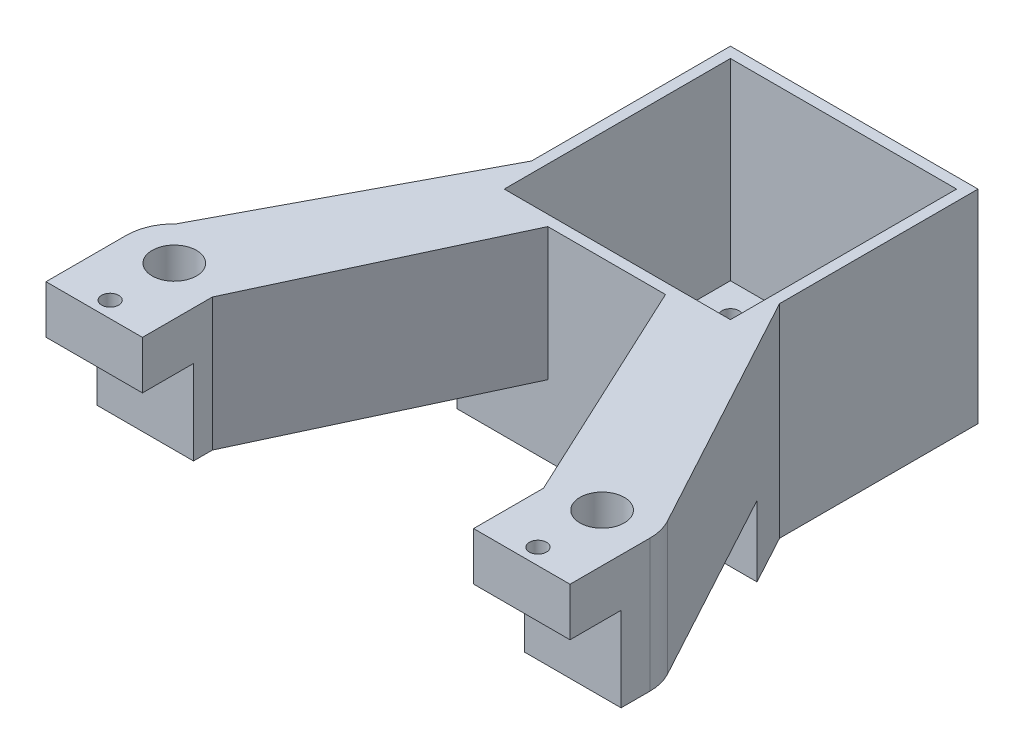
ISO-10303-21;
HEADER;
FILE_DESCRIPTION(('STEP AP214'),'2;1');
FILE_NAME('part.step','',(''),(''),'','','');
FILE_SCHEMA(('AUTOMOTIVE_DESIGN { 1 0 10303 214 1 1 1 1 }'));
ENDSEC;
DATA;
#1=APPLICATION_CONTEXT('core data for automotive mechanical design processes');
#2=APPLICATION_PROTOCOL_DEFINITION('international standard','automotive_design',2000,#1);
#3=PRODUCT_CONTEXT('',#1,'mechanical');
#4=PRODUCT('Part','Part','',(#3));
#5=PRODUCT_RELATED_PRODUCT_CATEGORY('part','',(#4));
#6=PRODUCT_DEFINITION_FORMATION('','',#4);
#7=PRODUCT_DEFINITION_CONTEXT('part definition',#1,'design');
#8=PRODUCT_DEFINITION('design','',#6,#7);
#9=PRODUCT_DEFINITION_SHAPE('','',#8);
#10=(LENGTH_UNIT() NAMED_UNIT(*) SI_UNIT(.MILLI.,.METRE.));
#11=(NAMED_UNIT(*) PLANE_ANGLE_UNIT() SI_UNIT($,.RADIAN.));
#12=(NAMED_UNIT(*) SI_UNIT($,.STERADIAN.) SOLID_ANGLE_UNIT());
#13=UNCERTAINTY_MEASURE_WITH_UNIT(LENGTH_MEASURE(1.E-05),#10,'distance_accuracy_value','');
#14=(GEOMETRIC_REPRESENTATION_CONTEXT(3) GLOBAL_UNCERTAINTY_ASSIGNED_CONTEXT((#13)) GLOBAL_UNIT_ASSIGNED_CONTEXT((#10,
#11,#12)) REPRESENTATION_CONTEXT('',''));
#15=CARTESIAN_POINT('',(0.,0.,0.));
#16=DIRECTION('',(0.,0.,1.));
#17=DIRECTION('',(1.,0.,0.));
#18=AXIS2_PLACEMENT_3D('',#15,#16,#17);
#19=CARTESIAN_POINT('',(0.,-19.8,0.));
#20=DIRECTION('',(0.,-1.,0.));
#21=DIRECTION('',(0.,0.,-1.));
#22=AXIS2_PLACEMENT_3D('',#19,#20,#21);
#23=PLANE('',#22);
#24=CARTESIAN_POINT('',(40.,-19.8,64.));
#25=DIRECTION('',(0.,-1.,0.));
#26=DIRECTION('',(0.,0.,-1.));
#27=AXIS2_PLACEMENT_3D('',#24,#25,#26);
#28=CIRCLE('',#27,4.15);
#29=CARTESIAN_POINT('',(40.,-19.8,59.85));
#30=VERTEX_POINT('',#29);
#31=EDGE_CURVE('E225',#30,#30,#28,.F.);
#32=ORIENTED_EDGE('',*,*,#31,.T.);
#33=EDGE_LOOP('',(#32));
#34=FACE_BOUND('',#33,.T.);
#35=DIRECTION('',(-1.,0.,0.));
#36=VECTOR('',#35,1.);
#37=CARTESIAN_POINT('',(0.,-19.8,23.15));
#38=LINE('',#37,#36);
#39=CARTESIAN_POINT('',(28.1190833832393,-19.8,23.15));
#40=VERTEX_POINT('',#39);
#41=CARTESIAN_POINT('',(11.0034052717595,-19.8,23.15));
#42=VERTEX_POINT('',#41);
#43=EDGE_CURVE('E48',#40,#42,#38,.T.);
#44=ORIENTED_EDGE('',*,*,#43,.F.);
#45=DIRECTION('',(0.476084939245589,0.,0.87939930101378));
#46=VECTOR('',#45,1.);
#47=CARTESIAN_POINT('',(12.0535181151364,-19.8,-6.52547532494617));
#48=LINE('',#47,#46);
#49=CARTESIAN_POINT('',(47.914593709124,-19.8,59.7152355467897));
#50=VERTEX_POINT('',#49);
#51=EDGE_CURVE('E372',#40,#50,#48,.T.);
#52=ORIENTED_EDGE('',*,*,#51,.T.);
#53=CARTESIAN_POINT('',(40.,-19.8,64.));
#54=DIRECTION('',(0.,-1.,0.));
#55=DIRECTION('',(0.,0.,-1.));
#56=AXIS2_PLACEMENT_3D('',#53,#54,#55);
#57=CIRCLE('',#56,8.99999999999998);
#58=CARTESIAN_POINT('',(49.,-19.8,64.));
#59=VERTEX_POINT('',#58);
#60=EDGE_CURVE('E369',#59,#50,#57,.F.);
#61=ORIENTED_EDGE('',*,*,#60,.F.);
#62=DIRECTION('',(0.,0.,1.));
#63=VECTOR('',#62,1.);
#64=CARTESIAN_POINT('',(49.,-19.8,0.));
#65=LINE('',#64,#63);
#66=CARTESIAN_POINT('',(49.,-19.8,69.4505109846348));
#67=VERTEX_POINT('',#66);
#68=EDGE_CURVE('E366',#59,#67,#65,.T.);
#69=ORIENTED_EDGE('',*,*,#68,.T.);
#70=DIRECTION('',(1.,0.,0.));
#71=VECTOR('',#70,1.);
#72=CARTESIAN_POINT('',(0.,-19.8,69.4505109846348));
#73=LINE('',#72,#71);
#74=CARTESIAN_POINT('',(30.9638982325282,-19.8,69.4505109846348));
#75=VERTEX_POINT('',#74);
#76=EDGE_CURVE('E464',#75,#67,#73,.T.);
#77=ORIENTED_EDGE('',*,*,#76,.F.);
#78=DIRECTION('',(0.,0.,-1.));
#79=VECTOR('',#78,1.);
#80=CARTESIAN_POINT('',(30.9638982325284,-19.8,0.));
#81=LINE('',#80,#79);
#82=CARTESIAN_POINT('',(30.9638982325282,-19.8,65.9194183730972));
#83=VERTEX_POINT('',#82);
#84=EDGE_CURVE('E364',#75,#83,#81,.T.);
#85=ORIENTED_EDGE('',*,*,#84,.T.);
#86=DIRECTION('',(0.42291036319294,0.,0.906171520576549));
#87=VECTOR('',#86,1.);
#88=CARTESIAN_POINT('',(0.163652382515475,-19.8,-0.0763765876055947));
#89=LINE('',#88,#87);
#90=EDGE_CURVE('E361',#42,#83,#89,.T.);
#91=ORIENTED_EDGE('',*,*,#90,.F.);
#92=EDGE_LOOP('',(#44,#52,#61,#69,#77,#85,#91));
#93=FACE_BOUND('',#92,.T.);
#94=ADVANCED_FACE('F37',(#34,#93),#23,.T.);
#95=CARTESIAN_POINT('',(23.15,-33.,-21.15));
#96=DIRECTION('',(1.,0.,0.));
#97=DIRECTION('',(0.,0.,-1.));
#98=AXIS2_PLACEMENT_3D('',#95,#96,#97);
#99=PLANE('',#98);
#100=DIRECTION('',(0.,1.,0.));
#101=VECTOR('',#100,1.);
#102=CARTESIAN_POINT('',(23.15,-33.,13.9713680087752));
#103=LINE('',#102,#101);
#104=CARTESIAN_POINT('',(23.15,-33.,13.9713680087752));
#105=VERTEX_POINT('',#104);
#106=CARTESIAN_POINT('',(23.15,5.,13.9713680087752));
#107=VERTEX_POINT('',#106);
#108=EDGE_CURVE('E391',#105,#107,#103,.T.);
#109=ORIENTED_EDGE('',*,*,#108,.F.);
#110=DIRECTION('',(0.,0.,1.));
#111=VECTOR('',#110,1.);
#112=CARTESIAN_POINT('',(23.15,-33.,-21.15));
#113=LINE('',#112,#111);
#114=CARTESIAN_POINT('',(23.15,-33.,-23.15));
#115=VERTEX_POINT('',#114);
#116=EDGE_CURVE('E300',#115,#105,#113,.T.);
#117=ORIENTED_EDGE('',*,*,#116,.F.);
#118=DIRECTION('',(0.,-1.,0.));
#119=VECTOR('',#118,1.);
#120=CARTESIAN_POINT('',(23.15,-33.,-23.15));
#121=LINE('',#120,#119);
#122=CARTESIAN_POINT('',(23.15,5.,-23.15));
#123=VERTEX_POINT('',#122);
#124=EDGE_CURVE('E236',#123,#115,#121,.T.);
#125=ORIENTED_EDGE('',*,*,#124,.F.);
#126=DIRECTION('',(0.,0.,-1.));
#127=VECTOR('',#126,1.);
#128=CARTESIAN_POINT('',(23.15,5.,-21.15));
#129=LINE('',#128,#127);
#130=EDGE_CURVE('E232',#107,#123,#129,.T.);
#131=ORIENTED_EDGE('',*,*,#130,.F.);
#132=EDGE_LOOP('',(#109,#117,#125,#131));
#133=FACE_BOUND('',#132,.T.);
#134=ADVANCED_FACE('F538',(#133),#99,.T.);
#135=CARTESIAN_POINT('',(-23.15,-33.,21.15));
#136=DIRECTION('',(-1.,0.,0.));
#137=DIRECTION('',(0.,0.,1.));
#138=AXIS2_PLACEMENT_3D('',#135,#136,#137);
#139=PLANE('',#138);
#140=DIRECTION('',(0.,0.,1.));
#141=VECTOR('',#140,1.);
#142=CARTESIAN_POINT('',(-23.15,5.,21.15));
#143=LINE('',#142,#141);
#144=CARTESIAN_POINT('',(-23.15,5.,-23.15));
#145=VERTEX_POINT('',#144);
#146=CARTESIAN_POINT('',(-23.15,5.,14.0503679174957));
#147=VERTEX_POINT('',#146);
#148=EDGE_CURVE('E214',#145,#147,#143,.T.);
#149=ORIENTED_EDGE('',*,*,#148,.F.);
#150=DIRECTION('',(0.,1.,0.));
#151=VECTOR('',#150,1.);
#152=CARTESIAN_POINT('',(-23.15,5.,-23.15));
#153=LINE('',#152,#151);
#154=CARTESIAN_POINT('',(-23.15,-33.,-23.15));
#155=VERTEX_POINT('',#154);
#156=EDGE_CURVE('E219',#155,#145,#153,.T.);
#157=ORIENTED_EDGE('',*,*,#156,.F.);
#158=DIRECTION('',(0.,0.,-1.));
#159=VECTOR('',#158,1.);
#160=CARTESIAN_POINT('',(-23.15,-33.,14.0503679174957));
#161=LINE('',#160,#159);
#162=CARTESIAN_POINT('',(-23.15,-33.,14.0503679174957));
#163=VERTEX_POINT('',#162);
#164=EDGE_CURVE('E298',#163,#155,#161,.T.);
#165=ORIENTED_EDGE('',*,*,#164,.F.);
#166=DIRECTION('',(0.,1.,0.));
#167=VECTOR('',#166,1.);
#168=CARTESIAN_POINT('',(-23.15,-33.,14.0503679174957));
#169=LINE('',#168,#167);
#170=EDGE_CURVE('E220',#163,#147,#169,.T.);
#171=ORIENTED_EDGE('',*,*,#170,.T.);
#172=EDGE_LOOP('',(#149,#157,#165,#171));
#173=FACE_BOUND('',#172,.T.);
#174=ADVANCED_FACE('F216',(#173),#139,.T.);
#175=CARTESIAN_POINT('',(-40.,-19.8,64.));
#176=DIRECTION('',(0.,-1.,0.));
#177=DIRECTION('',(0.,0.,-1.));
#178=AXIS2_PLACEMENT_3D('',#175,#176,#177);
#179=CIRCLE('',#178,4.15);
#180=CARTESIAN_POINT('',(-40.,-19.8,59.85));
#181=VERTEX_POINT('',#180);
#182=EDGE_CURVE('E374',#181,#181,#179,.F.);
#183=ORIENTED_EDGE('',*,*,#182,.T.);
#184=EDGE_LOOP('',(#183));
#185=FACE_BOUND('',#184,.T.);
#186=DIRECTION('',(-0.468856217453364,0.,0.88327450283325));
#187=VECTOR('',#186,1.);
#188=CARTESIAN_POINT('',(-12.2423633707478,-19.8,-6.4984420633526));
#189=LINE('',#188,#187);
#190=CARTESIAN_POINT('',(-27.9802300867228,-19.8,23.15));
#191=VERTEX_POINT('',#190);
#192=CARTESIAN_POINT('',(-46.2022692479095,-19.8,57.4783547952656));
#193=VERTEX_POINT('',#192);
#194=EDGE_CURVE('E348',#191,#193,#189,.T.);
#195=ORIENTED_EDGE('',*,*,#194,.F.);
#196=CARTESIAN_POINT('',(-11.0034052717595,-19.8,23.15));
#197=VERTEX_POINT('',#196);
#198=EDGE_CURVE('E11',#197,#191,#38,.T.);
#199=ORIENTED_EDGE('',*,*,#198,.F.);
#200=DIRECTION('',(-0.422910363192941,0.,0.906171520576549));
#201=VECTOR('',#200,1.);
#202=CARTESIAN_POINT('',(-0.163652382515457,-19.8,-0.076376587605586));
#203=LINE('',#202,#201);
#204=CARTESIAN_POINT('',(-30.9638982325283,-19.8,65.9194183730972));
#205=VERTEX_POINT('',#204);
#206=EDGE_CURVE('E359',#197,#205,#203,.T.);
#207=ORIENTED_EDGE('',*,*,#206,.T.);
#208=DIRECTION('',(0.,0.,1.));
#209=VECTOR('',#208,1.);
#210=CARTESIAN_POINT('',(-30.9638982325283,-19.8,0.));
#211=LINE('',#210,#209);
#212=CARTESIAN_POINT('',(-30.9638982325283,-19.8,69.4505109846348));
#213=VERTEX_POINT('',#212);
#214=EDGE_CURVE('E356',#205,#213,#211,.T.);
#215=ORIENTED_EDGE('',*,*,#214,.T.);
#216=CARTESIAN_POINT('',(-49.,-19.8,69.4505109846348));
#217=VERTEX_POINT('',#216);
#218=EDGE_CURVE('E46',#217,#213,#73,.T.);
#219=ORIENTED_EDGE('',*,*,#218,.F.);
#220=DIRECTION('',(0.,0.,1.));
#221=VECTOR('',#220,1.);
#222=CARTESIAN_POINT('',(-49.,-19.8,0.));
#223=LINE('',#222,#221);
#224=CARTESIAN_POINT('',(-49.,-19.8,64.));
#225=VERTEX_POINT('',#224);
#226=EDGE_CURVE('E353',#225,#217,#223,.T.);
#227=ORIENTED_EDGE('',*,*,#226,.F.);
#228=CARTESIAN_POINT('',(-40.,-19.8,64.));
#229=DIRECTION('',(0.,-1.,0.));
#230=DIRECTION('',(0.,0.,-1.));
#231=AXIS2_PLACEMENT_3D('',#228,#229,#230);
#232=CIRCLE('',#231,9.);
#233=EDGE_CURVE('E350',#193,#225,#232,.F.);
#234=ORIENTED_EDGE('',*,*,#233,.F.);
#235=EDGE_LOOP('',(#195,#199,#207,#215,#219,#227,#234));
#236=FACE_BOUND('',#235,.T.);
#237=ADVANCED_FACE('F475',(#185,#236),#23,.T.);
#238=CARTESIAN_POINT('',(0.,-33.,21.15));
#239=DIRECTION('',(0.,0.,1.));
#240=DIRECTION('',(1.,0.,0.));
#241=AXIS2_PLACEMENT_3D('',#238,#239,#240);
#242=PLANE('',#241);
#243=DIRECTION('',(0.,1.,0.));
#244=VECTOR('',#243,1.);
#245=CARTESIAN_POINT('',(21.15,-33.,21.15));
#246=LINE('',#245,#244);
#247=CARTESIAN_POINT('',(21.15,-31.,21.15));
#248=VERTEX_POINT('',#247);
#249=CARTESIAN_POINT('',(21.15,5.,21.15));
#250=VERTEX_POINT('',#249);
#251=EDGE_CURVE('E459',#248,#250,#246,.T.);
#252=ORIENTED_EDGE('',*,*,#251,.F.);
#253=DIRECTION('',(1.,0.,0.));
#254=VECTOR('',#253,1.);
#255=CARTESIAN_POINT('',(0.,-31.,21.15));
#256=LINE('',#255,#254);
#257=CARTESIAN_POINT('',(-21.15,-31.,21.15));
#258=VERTEX_POINT('',#257);
#259=EDGE_CURVE('E314',#258,#248,#256,.T.);
#260=ORIENTED_EDGE('',*,*,#259,.F.);
#261=DIRECTION('',(0.,1.,0.));
#262=VECTOR('',#261,1.);
#263=CARTESIAN_POINT('',(-21.15,-33.,21.15));
#264=LINE('',#263,#262);
#265=CARTESIAN_POINT('',(-21.15,5.,21.15));
#266=VERTEX_POINT('',#265);
#267=EDGE_CURVE('E417',#258,#266,#264,.T.);
#268=ORIENTED_EDGE('',*,*,#267,.T.);
#269=DIRECTION('',(-1.,0.,0.));
#270=VECTOR('',#269,1.);
#271=CARTESIAN_POINT('',(-21.15,5.,21.15));
#272=LINE('',#271,#270);
#273=EDGE_CURVE('E255',#250,#266,#272,.T.);
#274=ORIENTED_EDGE('',*,*,#273,.F.);
#275=EDGE_LOOP('',(#252,#260,#268,#274));
#276=FACE_BOUND('',#275,.T.);
#277=ADVANCED_FACE('F581',(#276),#242,.F.);
#278=CARTESIAN_POINT('',(21.15,-33.,0.));
#279=DIRECTION('',(1.,0.,0.));
#280=DIRECTION('',(0.,0.,-1.));
#281=AXIS2_PLACEMENT_3D('',#278,#279,#280);
#282=PLANE('',#281);
#283=DIRECTION('',(0.,1.,0.));
#284=VECTOR('',#283,1.);
#285=CARTESIAN_POINT('',(21.15,-33.,-21.15));
#286=LINE('',#285,#284);
#287=CARTESIAN_POINT('',(21.15,-31.,-21.15));
#288=VERTEX_POINT('',#287);
#289=CARTESIAN_POINT('',(21.15,5.,-21.15));
#290=VERTEX_POINT('',#289);
#291=EDGE_CURVE('E388',#288,#290,#286,.T.);
#292=ORIENTED_EDGE('',*,*,#291,.F.);
#293=DIRECTION('',(0.,0.,-1.));
#294=VECTOR('',#293,1.);
#295=CARTESIAN_POINT('',(21.15,-31.,0.));
#296=LINE('',#295,#294);
#297=EDGE_CURVE('E317',#248,#288,#296,.T.);
#298=ORIENTED_EDGE('',*,*,#297,.F.);
#299=ORIENTED_EDGE('',*,*,#251,.T.);
#300=DIRECTION('',(0.,0.,1.));
#301=VECTOR('',#300,1.);
#302=CARTESIAN_POINT('',(21.15,5.,21.15));
#303=LINE('',#302,#301);
#304=EDGE_CURVE('E252',#290,#250,#303,.T.);
#305=ORIENTED_EDGE('',*,*,#304,.F.);
#306=EDGE_LOOP('',(#292,#298,#299,#305));
#307=FACE_BOUND('',#306,.T.);
#308=ADVANCED_FACE('F584',(#307),#282,.F.);
#309=CARTESIAN_POINT('',(49.,-33.,0.));
#310=DIRECTION('',(-1.,0.,0.));
#311=DIRECTION('',(0.,0.,1.));
#312=AXIS2_PLACEMENT_3D('',#309,#310,#311);
#313=PLANE('',#312);
#314=DIRECTION('',(0.,1.,0.));
#315=VECTOR('',#314,1.);
#316=CARTESIAN_POINT('',(49.,-33.,79.));
#317=LINE('',#316,#315);
#318=CARTESIAN_POINT('',(49.,-4.,79.));
#319=VERTEX_POINT('',#318);
#320=CARTESIAN_POINT('',(49.,5.,79.));
#321=VERTEX_POINT('',#320);
#322=EDGE_CURVE('E453',#319,#321,#317,.T.);
#323=ORIENTED_EDGE('',*,*,#322,.F.);
#324=DIRECTION('',(0.,0.,1.));
#325=VECTOR('',#324,1.);
#326=CARTESIAN_POINT('',(49.,-4.,79.));
#327=LINE('',#326,#325);
#328=CARTESIAN_POINT('',(49.,-4.,69.4505109846348));
#329=VERTEX_POINT('',#328);
#330=EDGE_CURVE('E323',#329,#319,#327,.T.);
#331=ORIENTED_EDGE('',*,*,#330,.F.);
#332=DIRECTION('',(0.,1.,0.));
#333=VECTOR('',#332,1.);
#334=CARTESIAN_POINT('',(49.,-4.,69.4505109846348));
#335=LINE('',#334,#333);
#336=EDGE_CURVE('E319',#67,#329,#335,.T.);
#337=ORIENTED_EDGE('',*,*,#336,.F.);
#338=ORIENTED_EDGE('',*,*,#68,.F.);
#339=DIRECTION('',(0.,1.,0.));
#340=VECTOR('',#339,1.);
#341=CARTESIAN_POINT('',(49.,-33.,64.));
#342=LINE('',#341,#340);
#343=CARTESIAN_POINT('',(49.,5.,64.));
#344=VERTEX_POINT('',#343);
#345=EDGE_CURVE('E452',#59,#344,#342,.T.);
#346=ORIENTED_EDGE('',*,*,#345,.T.);
#347=DIRECTION('',(0.,0.,1.));
#348=VECTOR('',#347,1.);
#349=CARTESIAN_POINT('',(49.,5.,0.));
#350=LINE('',#349,#348);
#351=EDGE_CURVE('E434',#344,#321,#350,.T.);
#352=ORIENTED_EDGE('',*,*,#351,.T.);
#353=EDGE_LOOP('',(#323,#331,#337,#338,#346,#352));
#354=FACE_BOUND('',#353,.T.);
#355=ADVANCED_FACE('F531',(#354),#313,.F.);
#356=CARTESIAN_POINT('',(0.,-33.,79.));
#357=DIRECTION('',(0.,0.,-1.));
#358=DIRECTION('',(-1.,0.,0.));
#359=AXIS2_PLACEMENT_3D('',#356,#357,#358);
#360=PLANE('',#359);
#361=DIRECTION('',(0.,1.,0.));
#362=VECTOR('',#361,1.);
#363=CARTESIAN_POINT('',(30.9638982325282,-33.,79.));
#364=LINE('',#363,#362);
#365=CARTESIAN_POINT('',(30.9638982325282,-4.,79.));
#366=VERTEX_POINT('',#365);
#367=CARTESIAN_POINT('',(30.9638982325282,5.,79.));
#368=VERTEX_POINT('',#367);
#369=EDGE_CURVE('E455',#366,#368,#364,.T.);
#370=ORIENTED_EDGE('',*,*,#369,.F.);
#371=DIRECTION('',(1.,0.,0.));
#372=VECTOR('',#371,1.);
#373=CARTESIAN_POINT('',(-74.0000000000001,-4.,79.));
#374=LINE('',#373,#372);
#375=EDGE_CURVE('E326',#366,#319,#374,.T.);
#376=ORIENTED_EDGE('',*,*,#375,.T.);
#377=ORIENTED_EDGE('',*,*,#322,.T.);
#378=DIRECTION('',(-1.,0.,0.));
#379=VECTOR('',#378,1.);
#380=CARTESIAN_POINT('',(0.,5.,79.));
#381=LINE('',#380,#379);
#382=EDGE_CURVE('E449',#321,#368,#381,.T.);
#383=ORIENTED_EDGE('',*,*,#382,.T.);
#384=EDGE_LOOP('',(#370,#376,#377,#383));
#385=FACE_BOUND('',#384,.T.);
#386=ADVANCED_FACE('F574',(#385),#360,.F.);
#387=CARTESIAN_POINT('',(30.9638982325284,-33.,0.));
#388=DIRECTION('',(1.,0.,0.));
#389=DIRECTION('',(0.,0.,-1.));
#390=AXIS2_PLACEMENT_3D('',#387,#388,#389);
#391=PLANE('',#390);
#392=DIRECTION('',(0.,1.,0.));
#393=VECTOR('',#392,1.);
#394=CARTESIAN_POINT('',(30.9638982325282,-33.,69.4505109846348));
#395=LINE('',#394,#393);
#396=CARTESIAN_POINT('',(30.9638982325282,-4.,69.4505109846348));
#397=VERTEX_POINT('',#396);
#398=EDGE_CURVE('E63',#75,#397,#395,.T.);
#399=ORIENTED_EDGE('',*,*,#398,.T.);
#400=DIRECTION('',(0.,0.,1.));
#401=VECTOR('',#400,1.);
#402=CARTESIAN_POINT('',(30.9638982325284,-4.,0.));
#403=LINE('',#402,#401);
#404=EDGE_CURVE('E345',#397,#366,#403,.T.);
#405=ORIENTED_EDGE('',*,*,#404,.T.);
#406=ORIENTED_EDGE('',*,*,#369,.T.);
#407=DIRECTION('',(0.,0.,-1.));
#408=VECTOR('',#407,1.);
#409=CARTESIAN_POINT('',(30.9638982325284,5.,0.));
#410=LINE('',#409,#408);
#411=CARTESIAN_POINT('',(30.9638982325282,5.,65.9194183730972));
#412=VERTEX_POINT('',#411);
#413=EDGE_CURVE('E446',#368,#412,#410,.T.);
#414=ORIENTED_EDGE('',*,*,#413,.T.);
#415=DIRECTION('',(0.,1.,0.));
#416=VECTOR('',#415,1.);
#417=CARTESIAN_POINT('',(30.9638982325282,-33.,65.9194183730972));
#418=LINE('',#417,#416);
#419=EDGE_CURVE('E457',#83,#412,#418,.T.);
#420=ORIENTED_EDGE('',*,*,#419,.F.);
#421=ORIENTED_EDGE('',*,*,#84,.F.);
#422=EDGE_LOOP('',(#399,#405,#406,#414,#420,#421));
#423=FACE_BOUND('',#422,.T.);
#424=ADVANCED_FACE('F523',(#423),#391,.F.);
#425=CARTESIAN_POINT('',(0.163652382515475,-33.,-0.0763765876055947));
#426=DIRECTION('',(-0.906171520576549,0.,0.42291036319294));
#427=DIRECTION('',(0.42291036319294,0.,0.906171520576549));
#428=AXIS2_PLACEMENT_3D('',#425,#426,#427);
#429=PLANE('',#428);
#430=DIRECTION('',(0.,1.,0.));
#431=VECTOR('',#430,1.);
#432=CARTESIAN_POINT('',(11.0034052717595,-33.,23.15));
#433=LINE('',#432,#431);
#434=CARTESIAN_POINT('',(11.0034052717595,5.,23.15));
#435=VERTEX_POINT('',#434);
#436=EDGE_CURVE('E385',#42,#435,#433,.T.);
#437=ORIENTED_EDGE('',*,*,#436,.F.);
#438=ORIENTED_EDGE('',*,*,#90,.T.);
#439=ORIENTED_EDGE('',*,*,#419,.T.);
#440=DIRECTION('',(0.42291036319294,0.,0.906171520576549));
#441=VECTOR('',#440,1.);
#442=CARTESIAN_POINT('',(0.163652382515475,5.,-0.0763765876055947));
#443=LINE('',#442,#441);
#444=EDGE_CURVE('E443',#435,#412,#443,.T.);
#445=ORIENTED_EDGE('',*,*,#444,.F.);
#446=EDGE_LOOP('',(#437,#438,#439,#445));
#447=FACE_BOUND('',#446,.T.);
#448=ADVANCED_FACE('F521',(#447),#429,.T.);
#449=CARTESIAN_POINT('',(12.0535181151364,-33.,-6.52547532494617));
#450=DIRECTION('',(-0.87939930101378,0.,0.476084939245588));
#451=DIRECTION('',(0.476084939245589,0.,0.87939930101378));
#452=AXIS2_PLACEMENT_3D('',#449,#450,#451);
#453=PLANE('',#452);
#454=ORIENTED_EDGE('',*,*,#51,.F.);
#455=DIRECTION('',(0.,1.,0.));
#456=VECTOR('',#455,1.);
#457=CARTESIAN_POINT('',(28.1190833832393,-31.,23.15));
#458=LINE('',#457,#456);
#459=CARTESIAN_POINT('',(28.1190833832393,-33.,23.15));
#460=VERTEX_POINT('',#459);
#461=EDGE_CURVE('E303',#460,#40,#458,.T.);
#462=ORIENTED_EDGE('',*,*,#461,.F.);
#463=DIRECTION('',(0.476084939245589,0.,0.87939930101378));
#464=VECTOR('',#463,1.);
#465=CARTESIAN_POINT('',(23.15,-33.,13.9713680087752));
#466=LINE('',#465,#464);
#467=EDGE_CURVE('E289',#105,#460,#466,.T.);
#468=ORIENTED_EDGE('',*,*,#467,.F.);
#469=ORIENTED_EDGE('',*,*,#108,.T.);
#470=DIRECTION('',(0.476084939245589,0.,0.87939930101378));
#471=VECTOR('',#470,1.);
#472=CARTESIAN_POINT('',(12.0535181151364,5.,-6.52547532494617));
#473=LINE('',#472,#471);
#474=CARTESIAN_POINT('',(47.914593709124,5.,59.7152355467897));
#475=VERTEX_POINT('',#474);
#476=EDGE_CURVE('E440',#107,#475,#473,.T.);
#477=ORIENTED_EDGE('',*,*,#476,.T.);
#478=DIRECTION('',(0.,1.,0.));
#479=VECTOR('',#478,1.);
#480=CARTESIAN_POINT('',(47.914593709124,-33.,59.7152355467897));
#481=LINE('',#480,#479);
#482=EDGE_CURVE('E461',#50,#475,#481,.T.);
#483=ORIENTED_EDGE('',*,*,#482,.F.);
#484=EDGE_LOOP('',(#454,#462,#468,#469,#477,#483));
#485=FACE_BOUND('',#484,.T.);
#486=ADVANCED_FACE('F514',(#485),#453,.F.);
#487=CARTESIAN_POINT('',(40.,-33.,64.));
#488=DIRECTION('',(0.,1.,0.));
#489=DIRECTION('',(0.,0.,1.));
#490=AXIS2_PLACEMENT_3D('',#487,#488,#489);
#491=CYLINDRICAL_SURFACE('',#490,4.15);
#492=CARTESIAN_POINT('',(40.,5.,64.));
#493=DIRECTION('',(0.,1.,0.));
#494=DIRECTION('',(0.,0.,1.));
#495=AXIS2_PLACEMENT_3D('',#492,#493,#494);
#496=CIRCLE('',#495,4.15);
#497=CARTESIAN_POINT('',(40.,5.,68.15));
#498=VERTEX_POINT('',#497);
#499=EDGE_CURVE('E431',#498,#498,#496,.T.);
#500=ORIENTED_EDGE('',*,*,#499,.T.);
#501=EDGE_LOOP('',(#500));
#502=FACE_BOUND('',#501,.T.);
#503=ORIENTED_EDGE('',*,*,#31,.F.);
#504=EDGE_LOOP('',(#503));
#505=FACE_BOUND('',#504,.T.);
#506=ADVANCED_FACE('F591',(#502,#505),#491,.F.);
#507=CARTESIAN_POINT('',(40.,-33.,76.));
#508=DIRECTION('',(0.,1.,0.));
#509=DIRECTION('',(0.,0.,1.));
#510=AXIS2_PLACEMENT_3D('',#507,#508,#509);
#511=CYLINDRICAL_SURFACE('',#510,1.6);
#512=CARTESIAN_POINT('',(40.,-4.,76.));
#513=DIRECTION('',(0.,1.,0.));
#514=DIRECTION('',(0.,0.,1.));
#515=AXIS2_PLACEMENT_3D('',#512,#513,#514);
#516=CIRCLE('',#515,1.6);
#517=CARTESIAN_POINT('',(40.,-4.,77.6));
#518=VERTEX_POINT('',#517);
#519=EDGE_CURVE('E342',#518,#518,#516,.F.);
#520=ORIENTED_EDGE('',*,*,#519,.T.);
#521=EDGE_LOOP('',(#520));
#522=FACE_BOUND('',#521,.T.);
#523=CARTESIAN_POINT('',(40.,5.,76.));
#524=DIRECTION('',(0.,1.,0.));
#525=DIRECTION('',(0.,0.,1.));
#526=AXIS2_PLACEMENT_3D('',#523,#524,#525);
#527=CIRCLE('',#526,1.6);
#528=CARTESIAN_POINT('',(40.,5.,77.6));
#529=VERTEX_POINT('',#528);
#530=EDGE_CURVE('E419',#529,#529,#527,.T.);
#531=ORIENTED_EDGE('',*,*,#530,.T.);
#532=EDGE_LOOP('',(#531));
#533=FACE_BOUND('',#532,.T.);
#534=ADVANCED_FACE('F594',(#522,#533),#511,.F.);
#535=CARTESIAN_POINT('',(40.,-33.,64.));
#536=DIRECTION('',(0.,1.,0.));
#537=DIRECTION('',(0.,0.,1.));
#538=AXIS2_PLACEMENT_3D('',#535,#536,#537);
#539=CYLINDRICAL_SURFACE('',#538,8.99999999999998);
#540=ORIENTED_EDGE('',*,*,#345,.F.);
#541=ORIENTED_EDGE('',*,*,#60,.T.);
#542=ORIENTED_EDGE('',*,*,#482,.T.);
#543=CARTESIAN_POINT('',(40.,5.,64.));
#544=DIRECTION('',(0.,1.,0.));
#545=DIRECTION('',(0.,0.,1.));
#546=AXIS2_PLACEMENT_3D('',#543,#544,#545);
#547=CIRCLE('',#546,8.99999999999998);
#548=EDGE_CURVE('E437',#344,#475,#547,.T.);
#549=ORIENTED_EDGE('',*,*,#548,.F.);
#550=EDGE_LOOP('',(#540,#541,#542,#549));
#551=FACE_BOUND('',#550,.T.);
#552=ADVANCED_FACE('F536',(#551),#539,.T.);
#553=CARTESIAN_POINT('',(-21.15,-33.,0.));
#554=DIRECTION('',(-1.,0.,0.));
#555=DIRECTION('',(0.,0.,1.));
#556=AXIS2_PLACEMENT_3D('',#553,#554,#555);
#557=PLANE('',#556);
#558=ORIENTED_EDGE('',*,*,#267,.F.);
#559=DIRECTION('',(0.,0.,1.));
#560=VECTOR('',#559,1.);
#561=CARTESIAN_POINT('',(-21.15,-31.,0.));
#562=LINE('',#561,#560);
#563=CARTESIAN_POINT('',(-21.15,-31.,-21.15));
#564=VERTEX_POINT('',#563);
#565=EDGE_CURVE('E311',#564,#258,#562,.T.);
#566=ORIENTED_EDGE('',*,*,#565,.F.);
#567=DIRECTION('',(0.,1.,0.));
#568=VECTOR('',#567,1.);
#569=CARTESIAN_POINT('',(-21.15,-33.,-21.15));
#570=LINE('',#569,#568);
#571=CARTESIAN_POINT('',(-21.15,5.,-21.15));
#572=VERTEX_POINT('',#571);
#573=EDGE_CURVE('E224',#564,#572,#570,.T.);
#574=ORIENTED_EDGE('',*,*,#573,.T.);
#575=DIRECTION('',(0.,0.,-1.));
#576=VECTOR('',#575,1.);
#577=CARTESIAN_POINT('',(-21.15,5.,-21.15));
#578=LINE('',#577,#576);
#579=EDGE_CURVE('E248',#266,#572,#578,.T.);
#580=ORIENTED_EDGE('',*,*,#579,.F.);
#581=EDGE_LOOP('',(#558,#566,#574,#580));
#582=FACE_BOUND('',#581,.T.);
#583=ADVANCED_FACE('F550',(#582),#557,.F.);
#584=CARTESIAN_POINT('',(-12.2423633707478,-33.,-6.4984420633526));
#585=DIRECTION('',(-0.883274502833249,0.,-0.468856217453364));
#586=DIRECTION('',(-0.468856217453364,0.,0.88327450283325));
#587=AXIS2_PLACEMENT_3D('',#584,#585,#586);
#588=PLANE('',#587);
#589=ORIENTED_EDGE('',*,*,#170,.F.);
#590=DIRECTION('',(0.468856217453364,0.,-0.883274502833249));
#591=VECTOR('',#590,1.);
#592=CARTESIAN_POINT('',(-27.9802300867228,-33.,23.15));
#593=LINE('',#592,#591);
#594=CARTESIAN_POINT('',(-27.9802300867228,-33.,23.15));
#595=VERTEX_POINT('',#594);
#596=EDGE_CURVE('E295',#595,#163,#593,.T.);
#597=ORIENTED_EDGE('',*,*,#596,.F.);
#598=DIRECTION('',(0.,1.,0.));
#599=VECTOR('',#598,1.);
#600=CARTESIAN_POINT('',(-27.9802300867228,-31.,23.15));
#601=LINE('',#600,#599);
#602=EDGE_CURVE('E308',#595,#191,#601,.T.);
#603=ORIENTED_EDGE('',*,*,#602,.T.);
#604=ORIENTED_EDGE('',*,*,#194,.T.);
#605=DIRECTION('',(0.,1.,0.));
#606=VECTOR('',#605,1.);
#607=CARTESIAN_POINT('',(-46.2022692479095,-33.,57.4783547952656));
#608=LINE('',#607,#606);
#609=CARTESIAN_POINT('',(-46.2022692479095,5.,57.4783547952656));
#610=VERTEX_POINT('',#609);
#611=EDGE_CURVE('E416',#193,#610,#608,.T.);
#612=ORIENTED_EDGE('',*,*,#611,.T.);
#613=DIRECTION('',(-0.468856217453364,0.,0.883274502833249));
#614=VECTOR('',#613,1.);
#615=CARTESIAN_POINT('',(-12.2423633707478,5.,-6.4984420633526));
#616=LINE('',#615,#614);
#617=EDGE_CURVE('E399',#147,#610,#616,.T.);
#618=ORIENTED_EDGE('',*,*,#617,.F.);
#619=EDGE_LOOP('',(#589,#597,#603,#604,#612,#618));
#620=FACE_BOUND('',#619,.T.);
#621=ADVANCED_FACE('F506',(#620),#588,.T.);
#622=CARTESIAN_POINT('',(-0.163652382515457,-33.,-0.076376587605586));
#623=DIRECTION('',(-0.906171520576549,0.,-0.422910363192941));
#624=DIRECTION('',(-0.422910363192941,0.,0.906171520576549));
#625=AXIS2_PLACEMENT_3D('',#622,#623,#624);
#626=PLANE('',#625);
#627=ORIENTED_EDGE('',*,*,#206,.F.);
#628=DIRECTION('',(0.,1.,0.));
#629=VECTOR('',#628,1.);
#630=CARTESIAN_POINT('',(-11.0034052717595,-33.,23.15));
#631=LINE('',#630,#629);
#632=CARTESIAN_POINT('',(-11.0034052717595,5.,23.15));
#633=VERTEX_POINT('',#632);
#634=EDGE_CURVE('E383',#197,#633,#631,.T.);
#635=ORIENTED_EDGE('',*,*,#634,.T.);
#636=DIRECTION('',(-0.422910363192941,0.,0.906171520576549));
#637=VECTOR('',#636,1.);
#638=CARTESIAN_POINT('',(-0.163652382515457,5.,-0.076376587605586));
#639=LINE('',#638,#637);
#640=CARTESIAN_POINT('',(-30.9638982325283,5.,65.9194183730972));
#641=VERTEX_POINT('',#640);
#642=EDGE_CURVE('E413',#633,#641,#639,.T.);
#643=ORIENTED_EDGE('',*,*,#642,.T.);
#644=DIRECTION('',(0.,1.,0.));
#645=VECTOR('',#644,1.);
#646=CARTESIAN_POINT('',(-30.9638982325283,-33.,65.9194183730972));
#647=LINE('',#646,#645);
#648=EDGE_CURVE('E420',#205,#641,#647,.T.);
#649=ORIENTED_EDGE('',*,*,#648,.F.);
#650=EDGE_LOOP('',(#627,#635,#643,#649));
#651=FACE_BOUND('',#650,.T.);
#652=ADVANCED_FACE('F479',(#651),#626,.F.);
#653=CARTESIAN_POINT('',(-30.9638982325283,-33.,0.));
#654=DIRECTION('',(-1.,0.,0.));
#655=DIRECTION('',(0.,0.,1.));
#656=AXIS2_PLACEMENT_3D('',#653,#654,#655);
#657=PLANE('',#656);
#658=DIRECTION('',(0.,1.,0.));
#659=VECTOR('',#658,1.);
#660=CARTESIAN_POINT('',(-30.9638982325283,-33.,79.));
#661=LINE('',#660,#659);
#662=CARTESIAN_POINT('',(-30.9638982325283,-4.,79.));
#663=VERTEX_POINT('',#662);
#664=CARTESIAN_POINT('',(-30.9638982325283,5.,79.));
#665=VERTEX_POINT('',#664);
#666=EDGE_CURVE('E422',#663,#665,#661,.T.);
#667=ORIENTED_EDGE('',*,*,#666,.F.);
#668=DIRECTION('',(0.,0.,-1.));
#669=VECTOR('',#668,1.);
#670=CARTESIAN_POINT('',(-30.9638982325283,-4.,0.));
#671=LINE('',#670,#669);
#672=CARTESIAN_POINT('',(-30.9638982325283,-4.,69.4505109846348));
#673=VERTEX_POINT('',#672);
#674=EDGE_CURVE('E339',#663,#673,#671,.T.);
#675=ORIENTED_EDGE('',*,*,#674,.T.);
#676=DIRECTION('',(0.,-1.,0.));
#677=VECTOR('',#676,1.);
#678=CARTESIAN_POINT('',(-30.9638982325283,-33.,69.4505109846348));
#679=LINE('',#678,#677);
#680=EDGE_CURVE('E333',#673,#213,#679,.T.);
#681=ORIENTED_EDGE('',*,*,#680,.T.);
#682=ORIENTED_EDGE('',*,*,#214,.F.);
#683=ORIENTED_EDGE('',*,*,#648,.T.);
#684=DIRECTION('',(0.,0.,1.));
#685=VECTOR('',#684,1.);
#686=CARTESIAN_POINT('',(-30.9638982325283,5.,0.));
#687=LINE('',#686,#685);
#688=EDGE_CURVE('E410',#641,#665,#687,.T.);
#689=ORIENTED_EDGE('',*,*,#688,.T.);
#690=EDGE_LOOP('',(#667,#675,#681,#682,#683,#689));
#691=FACE_BOUND('',#690,.T.);
#692=ADVANCED_FACE('F472',(#691),#657,.F.);
#693=CARTESIAN_POINT('',(0.,-33.,79.));
#694=DIRECTION('',(0.,0.,-1.));
#695=DIRECTION('',(-1.,0.,0.));
#696=AXIS2_PLACEMENT_3D('',#693,#694,#695);
#697=PLANE('',#696);
#698=DIRECTION('',(0.,1.,0.));
#699=VECTOR('',#698,1.);
#700=CARTESIAN_POINT('',(-49.,-33.,79.));
#701=LINE('',#700,#699);
#702=CARTESIAN_POINT('',(-49.,-4.,79.));
#703=VERTEX_POINT('',#702);
#704=CARTESIAN_POINT('',(-49.,5.,79.));
#705=VERTEX_POINT('',#704);
#706=EDGE_CURVE('E424',#703,#705,#701,.T.);
#707=ORIENTED_EDGE('',*,*,#706,.F.);
#708=EDGE_CURVE('E329',#703,#663,#374,.T.);
#709=ORIENTED_EDGE('',*,*,#708,.T.);
#710=ORIENTED_EDGE('',*,*,#666,.T.);
#711=DIRECTION('',(-1.,0.,0.));
#712=VECTOR('',#711,1.);
#713=CARTESIAN_POINT('',(0.,5.,79.));
#714=LINE('',#713,#712);
#715=EDGE_CURVE('E407',#665,#705,#714,.T.);
#716=ORIENTED_EDGE('',*,*,#715,.T.);
#717=EDGE_LOOP('',(#707,#709,#710,#716));
#718=FACE_BOUND('',#717,.T.);
#719=ADVANCED_FACE('F492',(#718),#697,.F.);
#720=CARTESIAN_POINT('',(-49.,-33.,0.));
#721=DIRECTION('',(-1.,0.,0.));
#722=DIRECTION('',(0.,0.,1.));
#723=AXIS2_PLACEMENT_3D('',#720,#721,#722);
#724=PLANE('',#723);
#725=DIRECTION('',(0.,0.,-1.));
#726=VECTOR('',#725,1.);
#727=CARTESIAN_POINT('',(-49.,-4.,0.));
#728=LINE('',#727,#726);
#729=CARTESIAN_POINT('',(-49.,-4.,69.4505109846348));
#730=VERTEX_POINT('',#729);
#731=EDGE_CURVE('E337',#703,#730,#728,.T.);
#732=ORIENTED_EDGE('',*,*,#731,.F.);
#733=ORIENTED_EDGE('',*,*,#706,.T.);
#734=DIRECTION('',(0.,0.,1.));
#735=VECTOR('',#734,1.);
#736=CARTESIAN_POINT('',(-49.,5.,0.));
#737=LINE('',#736,#735);
#738=CARTESIAN_POINT('',(-49.,5.,64.));
#739=VERTEX_POINT('',#738);
#740=EDGE_CURVE('E404',#739,#705,#737,.T.);
#741=ORIENTED_EDGE('',*,*,#740,.F.);
#742=DIRECTION('',(0.,1.,0.));
#743=VECTOR('',#742,1.);
#744=CARTESIAN_POINT('',(-49.,-33.,64.));
#745=LINE('',#744,#743);
#746=EDGE_CURVE('E426',#225,#739,#745,.T.);
#747=ORIENTED_EDGE('',*,*,#746,.F.);
#748=ORIENTED_EDGE('',*,*,#226,.T.);
#749=DIRECTION('',(0.,-1.,0.));
#750=VECTOR('',#749,1.);
#751=CARTESIAN_POINT('',(-49.,-33.,69.4505109846348));
#752=LINE('',#751,#750);
#753=EDGE_CURVE('E55',#730,#217,#752,.T.);
#754=ORIENTED_EDGE('',*,*,#753,.F.);
#755=EDGE_LOOP('',(#732,#733,#741,#747,#748,#754));
#756=FACE_BOUND('',#755,.T.);
#757=ADVANCED_FACE('F497',(#756),#724,.T.);
#758=CARTESIAN_POINT('',(-40.,-33.,64.));
#759=DIRECTION('',(0.,1.,0.));
#760=DIRECTION('',(0.,0.,1.));
#761=AXIS2_PLACEMENT_3D('',#758,#759,#760);
#762=CYLINDRICAL_SURFACE('',#761,4.15);
#763=CARTESIAN_POINT('',(-40.,5.,64.));
#764=DIRECTION('',(0.,1.,0.));
#765=DIRECTION('',(0.,0.,1.));
#766=AXIS2_PLACEMENT_3D('',#763,#764,#765);
#767=CIRCLE('',#766,4.15);
#768=CARTESIAN_POINT('',(-40.,5.,68.15));
#769=VERTEX_POINT('',#768);
#770=EDGE_CURVE('E396',#769,#769,#767,.T.);
#771=ORIENTED_EDGE('',*,*,#770,.T.);
#772=EDGE_LOOP('',(#771));
#773=FACE_BOUND('',#772,.T.);
#774=ORIENTED_EDGE('',*,*,#182,.F.);
#775=EDGE_LOOP('',(#774));
#776=FACE_BOUND('',#775,.T.);
#777=ADVANCED_FACE('F562',(#773,#776),#762,.F.);
#778=CARTESIAN_POINT('',(-40.,-33.,76.));
#779=DIRECTION('',(0.,1.,0.));
#780=DIRECTION('',(0.,0.,1.));
#781=AXIS2_PLACEMENT_3D('',#778,#779,#780);
#782=CYLINDRICAL_SURFACE('',#781,1.6);
#783=CARTESIAN_POINT('',(-40.,-4.,76.));
#784=DIRECTION('',(0.,1.,0.));
#785=DIRECTION('',(0.,0.,1.));
#786=AXIS2_PLACEMENT_3D('',#783,#784,#785);
#787=CIRCLE('',#786,1.6);
#788=CARTESIAN_POINT('',(-40.,-4.,77.6));
#789=VERTEX_POINT('',#788);
#790=EDGE_CURVE('E41',#789,#789,#787,.F.);
#791=ORIENTED_EDGE('',*,*,#790,.T.);
#792=EDGE_LOOP('',(#791));
#793=FACE_BOUND('',#792,.T.);
#794=CARTESIAN_POINT('',(-40.,5.,76.));
#795=DIRECTION('',(0.,1.,0.));
#796=DIRECTION('',(0.,0.,1.));
#797=AXIS2_PLACEMENT_3D('',#794,#795,#796);
#798=CIRCLE('',#797,1.6);
#799=CARTESIAN_POINT('',(-40.,5.,77.6));
#800=VERTEX_POINT('',#799);
#801=EDGE_CURVE('E393',#800,#800,#798,.T.);
#802=ORIENTED_EDGE('',*,*,#801,.T.);
#803=EDGE_LOOP('',(#802));
#804=FACE_BOUND('',#803,.T.);
#805=ADVANCED_FACE('F565',(#793,#804),#782,.F.);
#806=CARTESIAN_POINT('',(-40.,-33.,64.));
#807=DIRECTION('',(0.,1.,0.));
#808=DIRECTION('',(0.,0.,1.));
#809=AXIS2_PLACEMENT_3D('',#806,#807,#808);
#810=CYLINDRICAL_SURFACE('',#809,9.);
#811=ORIENTED_EDGE('',*,*,#611,.F.);
#812=ORIENTED_EDGE('',*,*,#233,.T.);
#813=ORIENTED_EDGE('',*,*,#746,.T.);
#814=CARTESIAN_POINT('',(-40.,5.,64.));
#815=DIRECTION('',(0.,1.,0.));
#816=DIRECTION('',(0.,0.,1.));
#817=AXIS2_PLACEMENT_3D('',#814,#815,#816);
#818=CIRCLE('',#817,9.);
#819=EDGE_CURVE('E401',#610,#739,#818,.T.);
#820=ORIENTED_EDGE('',*,*,#819,.F.);
#821=EDGE_LOOP('',(#811,#812,#813,#820));
#822=FACE_BOUND('',#821,.T.);
#823=ADVANCED_FACE('F503',(#822),#810,.T.);
#824=CARTESIAN_POINT('',(21.15,-33.,23.15));
#825=DIRECTION('',(0.,0.,1.));
#826=DIRECTION('',(1.,0.,0.));
#827=AXIS2_PLACEMENT_3D('',#824,#825,#826);
#828=PLANE('',#827);
#829=ORIENTED_EDGE('',*,*,#634,.F.);
#830=ORIENTED_EDGE('',*,*,#198,.T.);
#831=ORIENTED_EDGE('',*,*,#602,.F.);
#832=DIRECTION('',(-1.,0.,0.));
#833=VECTOR('',#832,1.);
#834=CARTESIAN_POINT('',(28.1190833832393,-33.,23.15));
#835=LINE('',#834,#833);
#836=EDGE_CURVE('E292',#460,#595,#835,.T.);
#837=ORIENTED_EDGE('',*,*,#836,.F.);
#838=ORIENTED_EDGE('',*,*,#461,.T.);
#839=ORIENTED_EDGE('',*,*,#43,.T.);
#840=ORIENTED_EDGE('',*,*,#436,.T.);
#841=DIRECTION('',(1.,0.,0.));
#842=VECTOR('',#841,1.);
#843=CARTESIAN_POINT('',(21.15,5.,23.15));
#844=LINE('',#843,#842);
#845=EDGE_CURVE('E380',#633,#435,#844,.T.);
#846=ORIENTED_EDGE('',*,*,#845,.F.);
#847=EDGE_LOOP('',(#829,#830,#831,#837,#838,#839,#840,#846));
#848=FACE_BOUND('',#847,.T.);
#849=ADVANCED_FACE('F483',(#848),#828,.T.);
#850=CARTESIAN_POINT('',(0.,5.,0.));
#851=DIRECTION('',(0.,1.,0.));
#852=DIRECTION('',(0.,0.,1.));
#853=AXIS2_PLACEMENT_3D('',#850,#851,#852);
#854=PLANE('',#853);
#855=DIRECTION('',(1.,0.,0.));
#856=VECTOR('',#855,1.);
#857=CARTESIAN_POINT('',(23.15,5.,-23.15));
#858=LINE('',#857,#856);
#859=EDGE_CURVE('E228',#145,#123,#858,.T.);
#860=ORIENTED_EDGE('',*,*,#859,.F.);
#861=ORIENTED_EDGE('',*,*,#148,.T.);
#862=ORIENTED_EDGE('',*,*,#617,.T.);
#863=ORIENTED_EDGE('',*,*,#819,.T.);
#864=ORIENTED_EDGE('',*,*,#740,.T.);
#865=ORIENTED_EDGE('',*,*,#715,.F.);
#866=ORIENTED_EDGE('',*,*,#688,.F.);
#867=ORIENTED_EDGE('',*,*,#642,.F.);
#868=ORIENTED_EDGE('',*,*,#845,.T.);
#869=ORIENTED_EDGE('',*,*,#444,.T.);
#870=ORIENTED_EDGE('',*,*,#413,.F.);
#871=ORIENTED_EDGE('',*,*,#382,.F.);
#872=ORIENTED_EDGE('',*,*,#351,.F.);
#873=ORIENTED_EDGE('',*,*,#548,.T.);
#874=ORIENTED_EDGE('',*,*,#476,.F.);
#875=ORIENTED_EDGE('',*,*,#130,.T.);
#876=EDGE_LOOP('',(#860,#861,#862,#863,#864,#865,#866,#867,#868,#869,#870,#871,#872,#873,#874,#875));
#877=FACE_BOUND('',#876,.T.);
#878=ORIENTED_EDGE('',*,*,#579,.T.);
#879=DIRECTION('',(1.,0.,0.));
#880=VECTOR('',#879,1.);
#881=CARTESIAN_POINT('',(23.15,5.,-21.15));
#882=LINE('',#881,#880);
#883=EDGE_CURVE('E242',#572,#290,#882,.T.);
#884=ORIENTED_EDGE('',*,*,#883,.T.);
#885=ORIENTED_EDGE('',*,*,#304,.T.);
#886=ORIENTED_EDGE('',*,*,#273,.T.);
#887=EDGE_LOOP('',(#878,#884,#885,#886));
#888=FACE_BOUND('',#887,.T.);
#889=ORIENTED_EDGE('',*,*,#770,.F.);
#890=EDGE_LOOP('',(#889));
#891=FACE_BOUND('',#890,.T.);
#892=ORIENTED_EDGE('',*,*,#801,.F.);
#893=EDGE_LOOP('',(#892));
#894=FACE_BOUND('',#893,.T.);
#895=ORIENTED_EDGE('',*,*,#499,.F.);
#896=EDGE_LOOP('',(#895));
#897=FACE_BOUND('',#896,.T.);
#898=ORIENTED_EDGE('',*,*,#530,.F.);
#899=EDGE_LOOP('',(#898));
#900=FACE_BOUND('',#899,.T.);
#901=ADVANCED_FACE('F39',(#877,#888,#891,#894,#897,#900),#854,.T.);
#902=CARTESIAN_POINT('',(-74.0000000000001,-4.,69.4505109846348));
#903=DIRECTION('',(0.,0.,-1.));
#904=DIRECTION('',(-1.,0.,0.));
#905=AXIS2_PLACEMENT_3D('',#902,#903,#904);
#906=PLANE('',#905);
#907=ORIENTED_EDGE('',*,*,#76,.T.);
#908=ORIENTED_EDGE('',*,*,#336,.T.);
#909=DIRECTION('',(1.,0.,0.));
#910=VECTOR('',#909,1.);
#911=CARTESIAN_POINT('',(-74.0000000000001,-4.,69.4505109846348));
#912=LINE('',#911,#910);
#913=EDGE_CURVE('E325',#397,#329,#912,.T.);
#914=ORIENTED_EDGE('',*,*,#913,.F.);
#915=ORIENTED_EDGE('',*,*,#398,.F.);
#916=EDGE_LOOP('',(#907,#908,#914,#915));
#917=FACE_BOUND('',#916,.T.);
#918=ADVANCED_FACE('F608',(#917),#906,.F.);
#919=CARTESIAN_POINT('',(-74.0000000000001,-4.,79.));
#920=DIRECTION('',(0.,1.,0.));
#921=DIRECTION('',(0.,0.,1.));
#922=AXIS2_PLACEMENT_3D('',#919,#920,#921);
#923=PLANE('',#922);
#924=ORIENTED_EDGE('',*,*,#519,.F.);
#925=EDGE_LOOP('',(#924));
#926=FACE_BOUND('',#925,.T.);
#927=ORIENTED_EDGE('',*,*,#913,.T.);
#928=ORIENTED_EDGE('',*,*,#330,.T.);
#929=ORIENTED_EDGE('',*,*,#375,.F.);
#930=ORIENTED_EDGE('',*,*,#404,.F.);
#931=EDGE_LOOP('',(#927,#928,#929,#930));
#932=FACE_BOUND('',#931,.T.);
#933=ADVANCED_FACE('F613',(#926,#932),#923,.F.);
#934=ORIENTED_EDGE('',*,*,#790,.F.);
#935=EDGE_LOOP('',(#934));
#936=FACE_BOUND('',#935,.T.);
#937=ORIENTED_EDGE('',*,*,#708,.F.);
#938=ORIENTED_EDGE('',*,*,#731,.T.);
#939=EDGE_CURVE('E330',#730,#673,#912,.T.);
#940=ORIENTED_EDGE('',*,*,#939,.T.);
#941=ORIENTED_EDGE('',*,*,#674,.F.);
#942=EDGE_LOOP('',(#937,#938,#940,#941));
#943=FACE_BOUND('',#942,.T.);
#944=ADVANCED_FACE('F495',(#936,#943),#923,.F.);
#945=ORIENTED_EDGE('',*,*,#939,.F.);
#946=ORIENTED_EDGE('',*,*,#753,.T.);
#947=ORIENTED_EDGE('',*,*,#218,.T.);
#948=ORIENTED_EDGE('',*,*,#680,.F.);
#949=EDGE_LOOP('',(#945,#946,#947,#948));
#950=FACE_BOUND('',#949,.T.);
#951=ADVANCED_FACE('F466',(#950),#906,.F.);
#952=CARTESIAN_POINT('',(0.,-31.,0.));
#953=DIRECTION('',(0.,-1.,0.));
#954=DIRECTION('',(0.,0.,-1.));
#955=AXIS2_PLACEMENT_3D('',#952,#953,#954);
#956=PLANE('',#955);
#957=CARTESIAN_POINT('',(15.5,-31.,15.5));
#958=DIRECTION('',(0.,-1.,0.));
#959=DIRECTION('',(0.,0.,-1.));
#960=AXIS2_PLACEMENT_3D('',#957,#958,#959);
#961=CIRCLE('',#960,1.6);
#962=CARTESIAN_POINT('',(15.5,-31.,13.9));
#963=VERTEX_POINT('',#962);
#964=EDGE_CURVE('E271',#963,#963,#961,.T.);
#965=ORIENTED_EDGE('',*,*,#964,.T.);
#966=EDGE_LOOP('',(#965));
#967=FACE_BOUND('',#966,.T.);
#968=CARTESIAN_POINT('',(15.5,-31.,-15.5));
#969=DIRECTION('',(0.,-1.,0.));
#970=DIRECTION('',(0.,0.,-1.));
#971=AXIS2_PLACEMENT_3D('',#968,#969,#970);
#972=CIRCLE('',#971,1.6);
#973=CARTESIAN_POINT('',(15.5,-31.,-17.1));
#974=VERTEX_POINT('',#973);
#975=EDGE_CURVE('E278',#974,#974,#972,.T.);
#976=ORIENTED_EDGE('',*,*,#975,.T.);
#977=EDGE_LOOP('',(#976));
#978=FACE_BOUND('',#977,.T.);
#979=CARTESIAN_POINT('',(0.,-31.,0.));
#980=DIRECTION('',(0.,-1.,0.));
#981=DIRECTION('',(0.,0.,-1.));
#982=AXIS2_PLACEMENT_3D('',#979,#980,#981);
#983=CIRCLE('',#982,15.);
#984=CARTESIAN_POINT('',(0.,-31.,-15.));
#985=VERTEX_POINT('',#984);
#986=EDGE_CURVE('E259',#985,#985,#983,.T.);
#987=ORIENTED_EDGE('',*,*,#986,.T.);
#988=EDGE_LOOP('',(#987));
#989=FACE_BOUND('',#988,.T.);
#990=CARTESIAN_POINT('',(-15.5,-31.,-15.5));
#991=DIRECTION('',(0.,-1.,0.));
#992=DIRECTION('',(0.,0.,-1.));
#993=AXIS2_PLACEMENT_3D('',#990,#991,#992);
#994=CIRCLE('',#993,1.6);
#995=CARTESIAN_POINT('',(-15.5,-31.,-17.1));
#996=VERTEX_POINT('',#995);
#997=EDGE_CURVE('E265',#996,#996,#994,.T.);
#998=ORIENTED_EDGE('',*,*,#997,.T.);
#999=EDGE_LOOP('',(#998));
#1000=FACE_BOUND('',#999,.T.);
#1001=CARTESIAN_POINT('',(-15.5,-31.,15.5));
#1002=DIRECTION('',(0.,-1.,0.));
#1003=DIRECTION('',(0.,0.,-1.));
#1004=AXIS2_PLACEMENT_3D('',#1001,#1002,#1003);
#1005=CIRCLE('',#1004,1.6);
#1006=CARTESIAN_POINT('',(-15.5,-31.,13.9));
#1007=VERTEX_POINT('',#1006);
#1008=EDGE_CURVE('E283',#1007,#1007,#1005,.T.);
#1009=ORIENTED_EDGE('',*,*,#1008,.T.);
#1010=EDGE_LOOP('',(#1009));
#1011=FACE_BOUND('',#1010,.T.);
#1012=DIRECTION('',(1.,0.,0.));
#1013=VECTOR('',#1012,1.);
#1014=CARTESIAN_POINT('',(-23.15,-31.,-21.15));
#1015=LINE('',#1014,#1013);
#1016=EDGE_CURVE('E286',#564,#288,#1015,.T.);
#1017=ORIENTED_EDGE('',*,*,#1016,.F.);
#1018=ORIENTED_EDGE('',*,*,#565,.T.);
#1019=ORIENTED_EDGE('',*,*,#259,.T.);
#1020=ORIENTED_EDGE('',*,*,#297,.T.);
#1021=EDGE_LOOP('',(#1017,#1018,#1019,#1020));
#1022=FACE_BOUND('',#1021,.T.);
#1023=ADVANCED_FACE('F795',(#967,#978,#989,#1000,#1011,#1022),#956,.F.);
#1024=CARTESIAN_POINT('',(0.,-33.,0.));
#1025=DIRECTION('',(0.,-1.,0.));
#1026=DIRECTION('',(0.,0.,-1.));
#1027=AXIS2_PLACEMENT_3D('',#1024,#1025,#1026);
#1028=PLANE('',#1027);
#1029=CARTESIAN_POINT('',(15.5,-33.,15.5));
#1030=DIRECTION('',(0.,-1.,0.));
#1031=DIRECTION('',(0.,0.,-1.));
#1032=AXIS2_PLACEMENT_3D('',#1029,#1030,#1031);
#1033=CIRCLE('',#1032,1.6);
#1034=CARTESIAN_POINT('',(15.5,-33.,13.9));
#1035=VERTEX_POINT('',#1034);
#1036=EDGE_CURVE('E275',#1035,#1035,#1033,.T.);
#1037=ORIENTED_EDGE('',*,*,#1036,.F.);
#1038=EDGE_LOOP('',(#1037));
#1039=FACE_BOUND('',#1038,.T.);
#1040=CARTESIAN_POINT('',(15.5,-33.,-15.5));
#1041=DIRECTION('',(0.,-1.,0.));
#1042=DIRECTION('',(0.,0.,-1.));
#1043=AXIS2_PLACEMENT_3D('',#1040,#1041,#1042);
#1044=CIRCLE('',#1043,1.6);
#1045=CARTESIAN_POINT('',(15.5,-33.,-17.1));
#1046=VERTEX_POINT('',#1045);
#1047=EDGE_CURVE('E268',#1046,#1046,#1044,.T.);
#1048=ORIENTED_EDGE('',*,*,#1047,.F.);
#1049=EDGE_LOOP('',(#1048));
#1050=FACE_BOUND('',#1049,.T.);
#1051=CARTESIAN_POINT('',(0.,-33.,0.));
#1052=DIRECTION('',(0.,-1.,0.));
#1053=DIRECTION('',(0.,0.,-1.));
#1054=AXIS2_PLACEMENT_3D('',#1051,#1052,#1053);
#1055=CIRCLE('',#1054,15.);
#1056=CARTESIAN_POINT('',(0.,-33.,-15.));
#1057=VERTEX_POINT('',#1056);
#1058=EDGE_CURVE('E258',#1057,#1057,#1055,.T.);
#1059=ORIENTED_EDGE('',*,*,#1058,.F.);
#1060=EDGE_LOOP('',(#1059));
#1061=FACE_BOUND('',#1060,.T.);
#1062=CARTESIAN_POINT('',(-15.5,-33.,-15.5));
#1063=DIRECTION('',(0.,-1.,0.));
#1064=DIRECTION('',(0.,0.,-1.));
#1065=AXIS2_PLACEMENT_3D('',#1062,#1063,#1064);
#1066=CIRCLE('',#1065,1.6);
#1067=CARTESIAN_POINT('',(-15.5,-33.,-17.1));
#1068=VERTEX_POINT('',#1067);
#1069=EDGE_CURVE('E262',#1068,#1068,#1066,.T.);
#1070=ORIENTED_EDGE('',*,*,#1069,.F.);
#1071=EDGE_LOOP('',(#1070));
#1072=FACE_BOUND('',#1071,.T.);
#1073=CARTESIAN_POINT('',(-15.5,-33.,15.5));
#1074=DIRECTION('',(0.,-1.,0.));
#1075=DIRECTION('',(0.,0.,-1.));
#1076=AXIS2_PLACEMENT_3D('',#1073,#1074,#1075);
#1077=CIRCLE('',#1076,1.6);
#1078=CARTESIAN_POINT('',(-15.5,-33.,13.9));
#1079=VERTEX_POINT('',#1078);
#1080=EDGE_CURVE('E274',#1079,#1079,#1077,.T.);
#1081=ORIENTED_EDGE('',*,*,#1080,.F.);
#1082=EDGE_LOOP('',(#1081));
#1083=FACE_BOUND('',#1082,.T.);
#1084=ORIENTED_EDGE('',*,*,#467,.T.);
#1085=ORIENTED_EDGE('',*,*,#836,.T.);
#1086=ORIENTED_EDGE('',*,*,#596,.T.);
#1087=ORIENTED_EDGE('',*,*,#164,.T.);
#1088=DIRECTION('',(-1.,0.,0.));
#1089=VECTOR('',#1088,1.);
#1090=CARTESIAN_POINT('',(-23.15,-33.,-23.15));
#1091=LINE('',#1090,#1089);
#1092=EDGE_CURVE('E241',#115,#155,#1091,.T.);
#1093=ORIENTED_EDGE('',*,*,#1092,.F.);
#1094=ORIENTED_EDGE('',*,*,#116,.T.);
#1095=EDGE_LOOP('',(#1084,#1085,#1086,#1087,#1093,#1094));
#1096=FACE_BOUND('',#1095,.T.);
#1097=ADVANCED_FACE('F510',(#1039,#1050,#1061,#1072,#1083,#1096),#1028,.T.);
#1098=CARTESIAN_POINT('',(-15.5,-31.,15.5));
#1099=DIRECTION('',(0.,-1.,0.));
#1100=DIRECTION('',(0.,0.,-1.));
#1101=AXIS2_PLACEMENT_3D('',#1098,#1099,#1100);
#1102=CYLINDRICAL_SURFACE('',#1101,1.6);
#1103=ORIENTED_EDGE('',*,*,#1008,.F.);
#1104=EDGE_LOOP('',(#1103));
#1105=FACE_BOUND('',#1104,.T.);
#1106=ORIENTED_EDGE('',*,*,#1080,.T.);
#1107=EDGE_LOOP('',(#1106));
#1108=FACE_BOUND('',#1107,.T.);
#1109=ADVANCED_FACE('F779',(#1105,#1108),#1102,.F.);
#1110=CARTESIAN_POINT('',(-15.5,-31.,-15.5));
#1111=DIRECTION('',(0.,-1.,0.));
#1112=DIRECTION('',(0.,0.,-1.));
#1113=AXIS2_PLACEMENT_3D('',#1110,#1111,#1112);
#1114=CYLINDRICAL_SURFACE('',#1113,1.6);
#1115=ORIENTED_EDGE('',*,*,#997,.F.);
#1116=EDGE_LOOP('',(#1115));
#1117=FACE_BOUND('',#1116,.T.);
#1118=ORIENTED_EDGE('',*,*,#1069,.T.);
#1119=EDGE_LOOP('',(#1118));
#1120=FACE_BOUND('',#1119,.T.);
#1121=ADVANCED_FACE('F770',(#1117,#1120),#1114,.F.);
#1122=CARTESIAN_POINT('',(0.,-31.,0.));
#1123=DIRECTION('',(0.,-1.,0.));
#1124=DIRECTION('',(0.,0.,-1.));
#1125=AXIS2_PLACEMENT_3D('',#1122,#1123,#1124);
#1126=CYLINDRICAL_SURFACE('',#1125,15.);
#1127=ORIENTED_EDGE('',*,*,#986,.F.);
#1128=EDGE_LOOP('',(#1127));
#1129=FACE_BOUND('',#1128,.T.);
#1130=ORIENTED_EDGE('',*,*,#1058,.T.);
#1131=EDGE_LOOP('',(#1130));
#1132=FACE_BOUND('',#1131,.T.);
#1133=ADVANCED_FACE('F761',(#1129,#1132),#1126,.F.);
#1134=CARTESIAN_POINT('',(15.5,-31.,-15.5));
#1135=DIRECTION('',(0.,-1.,0.));
#1136=DIRECTION('',(0.,0.,-1.));
#1137=AXIS2_PLACEMENT_3D('',#1134,#1135,#1136);
#1138=CYLINDRICAL_SURFACE('',#1137,1.6);
#1139=ORIENTED_EDGE('',*,*,#975,.F.);
#1140=EDGE_LOOP('',(#1139));
#1141=FACE_BOUND('',#1140,.T.);
#1142=ORIENTED_EDGE('',*,*,#1047,.T.);
#1143=EDGE_LOOP('',(#1142));
#1144=FACE_BOUND('',#1143,.T.);
#1145=ADVANCED_FACE('F752',(#1141,#1144),#1138,.F.);
#1146=CARTESIAN_POINT('',(15.5,-31.,15.5));
#1147=DIRECTION('',(0.,-1.,0.));
#1148=DIRECTION('',(0.,0.,-1.));
#1149=AXIS2_PLACEMENT_3D('',#1146,#1147,#1148);
#1150=CYLINDRICAL_SURFACE('',#1149,1.6);
#1151=ORIENTED_EDGE('',*,*,#964,.F.);
#1152=EDGE_LOOP('',(#1151));
#1153=FACE_BOUND('',#1152,.T.);
#1154=ORIENTED_EDGE('',*,*,#1036,.T.);
#1155=EDGE_LOOP('',(#1154));
#1156=FACE_BOUND('',#1155,.T.);
#1157=ADVANCED_FACE('F746',(#1153,#1156),#1150,.F.);
#1158=CARTESIAN_POINT('',(0.,0.,-21.15));
#1159=DIRECTION('',(0.,0.,1.));
#1160=DIRECTION('',(1.,0.,0.));
#1161=AXIS2_PLACEMENT_3D('',#1158,#1159,#1160);
#1162=PLANE('',#1161);
#1163=ORIENTED_EDGE('',*,*,#573,.F.);
#1164=ORIENTED_EDGE('',*,*,#1016,.T.);
#1165=ORIENTED_EDGE('',*,*,#291,.T.);
#1166=ORIENTED_EDGE('',*,*,#883,.F.);
#1167=EDGE_LOOP('',(#1163,#1164,#1165,#1166));
#1168=FACE_BOUND('',#1167,.T.);
#1169=ADVANCED_FACE('F751',(#1168),#1162,.T.);
#1170=CARTESIAN_POINT('',(0.,0.,-23.15));
#1171=DIRECTION('',(0.,0.,1.));
#1172=DIRECTION('',(1.,0.,0.));
#1173=AXIS2_PLACEMENT_3D('',#1170,#1171,#1172);
#1174=PLANE('',#1173);
#1175=ORIENTED_EDGE('',*,*,#156,.T.);
#1176=ORIENTED_EDGE('',*,*,#859,.T.);
#1177=ORIENTED_EDGE('',*,*,#124,.T.);
#1178=ORIENTED_EDGE('',*,*,#1092,.T.);
#1179=EDGE_LOOP('',(#1175,#1176,#1177,#1178));
#1180=FACE_BOUND('',#1179,.T.);
#1181=ADVANCED_FACE('F239',(#1180),#1174,.F.);
#1182=CLOSED_SHELL('',(#94,#134,#174,#237,#277,#308,#355,#386,#424,#448,#486,#506,#534,#552,
#583,#621,#652,#692,#719,#757,#777,#805,#823,#849,#901,#918,#933,#944,#951,#1023,#1097,#1109,
#1121,#1133,#1145,#1157,#1169,#1181));
#1183=MANIFOLD_SOLID_BREP('B2',#1182);
#1184=ADVANCED_BREP_SHAPE_REPRESENTATION('',(#18,#1183),#14);
#1185=SHAPE_DEFINITION_REPRESENTATION(#9,#1184);
ENDSEC;
END-ISO-10303-21;
